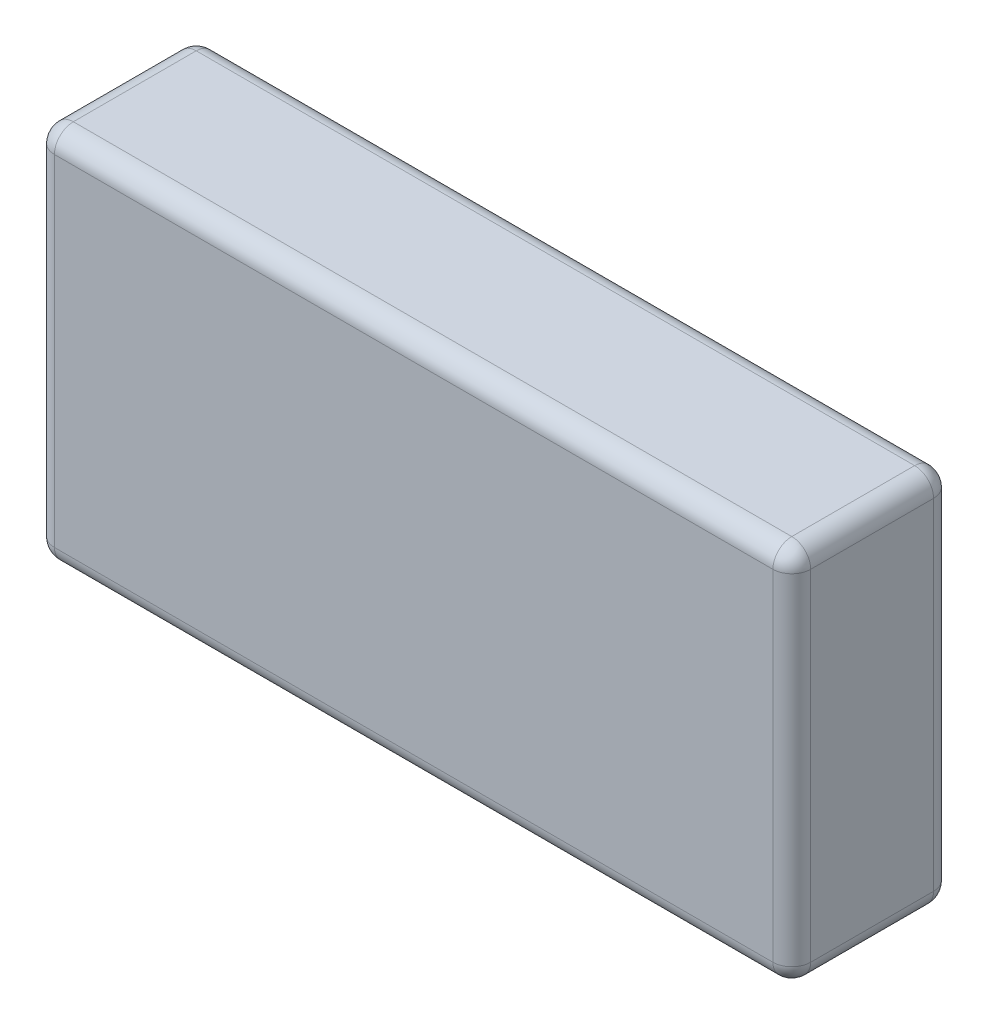
ISO-10303-21;
HEADER;
FILE_DESCRIPTION(('STEP AP214'),'2;1');
FILE_NAME('part.step','',(''),(''),'','','');
FILE_SCHEMA(('AUTOMOTIVE_DESIGN { 1 0 10303 214 1 1 1 1 }'));
ENDSEC;
DATA;
#1=APPLICATION_CONTEXT('core data for automotive mechanical design processes');
#2=APPLICATION_PROTOCOL_DEFINITION('international standard','automotive_design',2000,#1);
#3=PRODUCT_CONTEXT('',#1,'mechanical');
#4=PRODUCT('Part','Part','',(#3));
#5=PRODUCT_RELATED_PRODUCT_CATEGORY('part','',(#4));
#6=PRODUCT_DEFINITION_FORMATION('','',#4);
#7=PRODUCT_DEFINITION_CONTEXT('part definition',#1,'design');
#8=PRODUCT_DEFINITION('design','',#6,#7);
#9=PRODUCT_DEFINITION_SHAPE('','',#8);
#10=(LENGTH_UNIT() NAMED_UNIT(*) SI_UNIT(.MILLI.,.METRE.));
#11=(NAMED_UNIT(*) PLANE_ANGLE_UNIT() SI_UNIT($,.RADIAN.));
#12=(NAMED_UNIT(*) SI_UNIT($,.STERADIAN.) SOLID_ANGLE_UNIT());
#13=UNCERTAINTY_MEASURE_WITH_UNIT(LENGTH_MEASURE(1.E-05),#10,'distance_accuracy_value','');
#14=(GEOMETRIC_REPRESENTATION_CONTEXT(3) GLOBAL_UNCERTAINTY_ASSIGNED_CONTEXT((#13)) GLOBAL_UNIT_ASSIGNED_CONTEXT((#10,
#11,#12)) REPRESENTATION_CONTEXT('',''));
#15=CARTESIAN_POINT('',(0.,0.,0.));
#16=DIRECTION('',(0.,0.,1.));
#17=DIRECTION('',(1.,0.,0.));
#18=AXIS2_PLACEMENT_3D('',#15,#16,#17);
#19=CARTESIAN_POINT('',(0.,0.,17.));
#20=DIRECTION('',(1.,0.,0.));
#21=DIRECTION('',(0.,0.,-1.));
#22=AXIS2_PLACEMENT_3D('',#19,#20,#21);
#23=PLANE('',#22);
#24=DIRECTION('',(0.,0.,-1.));
#25=VECTOR('',#24,1.);
#26=CARTESIAN_POINT('',(0.,38.,17.));
#27=LINE('',#26,#25);
#28=CARTESIAN_POINT('',(0.,38.,15.));
#29=VERTEX_POINT('',#28);
#30=CARTESIAN_POINT('',(0.,38.,2.));
#31=VERTEX_POINT('',#30);
#32=EDGE_CURVE('E259',#29,#31,#27,.T.);
#33=ORIENTED_EDGE('',*,*,#32,.T.);
#34=DIRECTION('',(0.,-1.,0.));
#35=VECTOR('',#34,1.);
#36=CARTESIAN_POINT('',(0.,2.,2.));
#37=LINE('',#36,#35);
#38=CARTESIAN_POINT('',(0.,2.,2.));
#39=VERTEX_POINT('',#38);
#40=EDGE_CURVE('E224',#31,#39,#37,.T.);
#41=ORIENTED_EDGE('',*,*,#40,.T.);
#42=DIRECTION('',(0.,0.,-1.));
#43=VECTOR('',#42,1.);
#44=CARTESIAN_POINT('',(0.,2.,17.));
#45=LINE('',#44,#43);
#46=CARTESIAN_POINT('',(0.,2.,15.));
#47=VERTEX_POINT('',#46);
#48=EDGE_CURVE('E150',#39,#47,#45,.F.);
#49=ORIENTED_EDGE('',*,*,#48,.T.);
#50=DIRECTION('',(0.,-1.,0.));
#51=VECTOR('',#50,1.);
#52=CARTESIAN_POINT('',(0.,0.,15.));
#53=LINE('',#52,#51);
#54=EDGE_CURVE('E137',#47,#29,#53,.F.);
#55=ORIENTED_EDGE('',*,*,#54,.T.);
#56=EDGE_LOOP('',(#33,#41,#49,#55));
#57=FACE_BOUND('',#56,.T.);
#58=ADVANCED_FACE('F37',(#57),#23,.F.);
#59=CARTESIAN_POINT('',(0.,0.,17.));
#60=DIRECTION('',(0.,1.,0.));
#61=DIRECTION('',(0.,0.,1.));
#62=AXIS2_PLACEMENT_3D('',#59,#60,#61);
#63=PLANE('',#62);
#64=DIRECTION('',(0.,0.,-1.));
#65=VECTOR('',#64,1.);
#66=CARTESIAN_POINT('',(2.,0.,17.));
#67=LINE('',#66,#65);
#68=CARTESIAN_POINT('',(2.,0.,15.));
#69=VERTEX_POINT('',#68);
#70=CARTESIAN_POINT('',(2.,0.,2.));
#71=VERTEX_POINT('',#70);
#72=EDGE_CURVE('E262',#69,#71,#67,.T.);
#73=ORIENTED_EDGE('',*,*,#72,.T.);
#74=DIRECTION('',(1.,0.,0.));
#75=VECTOR('',#74,1.);
#76=CARTESIAN_POINT('',(78.,0.,2.));
#77=LINE('',#76,#75);
#78=CARTESIAN_POINT('',(78.,0.,2.));
#79=VERTEX_POINT('',#78);
#80=EDGE_CURVE('E236',#71,#79,#77,.T.);
#81=ORIENTED_EDGE('',*,*,#80,.T.);
#82=DIRECTION('',(0.,0.,-1.));
#83=VECTOR('',#82,1.);
#84=CARTESIAN_POINT('',(78.,0.,17.));
#85=LINE('',#84,#83);
#86=CARTESIAN_POINT('',(78.,0.,15.));
#87=VERTEX_POINT('',#86);
#88=EDGE_CURVE('E187',#79,#87,#85,.F.);
#89=ORIENTED_EDGE('',*,*,#88,.T.);
#90=DIRECTION('',(1.,0.,0.));
#91=VECTOR('',#90,1.);
#92=CARTESIAN_POINT('',(0.,0.,15.));
#93=LINE('',#92,#91);
#94=EDGE_CURVE('E238',#87,#69,#93,.F.);
#95=ORIENTED_EDGE('',*,*,#94,.T.);
#96=EDGE_LOOP('',(#73,#81,#89,#95));
#97=FACE_BOUND('',#96,.T.);
#98=ADVANCED_FACE('F268',(#97),#63,.F.);
#99=CARTESIAN_POINT('',(80.,40.,17.));
#100=DIRECTION('',(-1.,0.,0.));
#101=DIRECTION('',(0.,0.,1.));
#102=AXIS2_PLACEMENT_3D('',#99,#100,#101);
#103=PLANE('',#102);
#104=DIRECTION('',(0.,0.,-1.));
#105=VECTOR('',#104,1.);
#106=CARTESIAN_POINT('',(80.,2.,17.));
#107=LINE('',#106,#105);
#108=CARTESIAN_POINT('',(80.,2.,15.));
#109=VERTEX_POINT('',#108);
#110=CARTESIAN_POINT('',(80.,2.,2.));
#111=VERTEX_POINT('',#110);
#112=EDGE_CURVE('E132',#109,#111,#107,.T.);
#113=ORIENTED_EDGE('',*,*,#112,.T.);
#114=DIRECTION('',(0.,1.,0.));
#115=VECTOR('',#114,1.);
#116=CARTESIAN_POINT('',(80.,38.,2.));
#117=LINE('',#116,#115);
#118=CARTESIAN_POINT('',(80.,38.,2.));
#119=VERTEX_POINT('',#118);
#120=EDGE_CURVE('E127',#111,#119,#117,.T.);
#121=ORIENTED_EDGE('',*,*,#120,.T.);
#122=DIRECTION('',(0.,0.,-1.));
#123=VECTOR('',#122,1.);
#124=CARTESIAN_POINT('',(80.,38.,17.));
#125=LINE('',#124,#123);
#126=CARTESIAN_POINT('',(80.,38.,15.));
#127=VERTEX_POINT('',#126);
#128=EDGE_CURVE('E130',#119,#127,#125,.F.);
#129=ORIENTED_EDGE('',*,*,#128,.T.);
#130=DIRECTION('',(0.,1.,0.));
#131=VECTOR('',#130,1.);
#132=CARTESIAN_POINT('',(80.,40.,15.));
#133=LINE('',#132,#131);
#134=EDGE_CURVE('E138',#127,#109,#133,.F.);
#135=ORIENTED_EDGE('',*,*,#134,.T.);
#136=EDGE_LOOP('',(#113,#121,#129,#135));
#137=FACE_BOUND('',#136,.T.);
#138=ADVANCED_FACE('F129',(#137),#103,.F.);
#139=CARTESIAN_POINT('',(0.,40.,17.));
#140=DIRECTION('',(0.,-1.,0.));
#141=DIRECTION('',(0.,0.,-1.));
#142=AXIS2_PLACEMENT_3D('',#139,#140,#141);
#143=PLANE('',#142);
#144=DIRECTION('',(0.,0.,-1.));
#145=VECTOR('',#144,1.);
#146=CARTESIAN_POINT('',(78.,40.,17.));
#147=LINE('',#146,#145);
#148=CARTESIAN_POINT('',(78.,40.,15.));
#149=VERTEX_POINT('',#148);
#150=CARTESIAN_POINT('',(78.,40.,2.));
#151=VERTEX_POINT('',#150);
#152=EDGE_CURVE('E251',#149,#151,#147,.T.);
#153=ORIENTED_EDGE('',*,*,#152,.T.);
#154=DIRECTION('',(-1.,0.,0.));
#155=VECTOR('',#154,1.);
#156=CARTESIAN_POINT('',(2.,40.,2.));
#157=LINE('',#156,#155);
#158=CARTESIAN_POINT('',(2.,40.,2.));
#159=VERTEX_POINT('',#158);
#160=EDGE_CURVE('E220',#151,#159,#157,.T.);
#161=ORIENTED_EDGE('',*,*,#160,.T.);
#162=DIRECTION('',(0.,0.,-1.));
#163=VECTOR('',#162,1.);
#164=CARTESIAN_POINT('',(2.,40.,17.));
#165=LINE('',#164,#163);
#166=CARTESIAN_POINT('',(2.,40.,15.));
#167=VERTEX_POINT('',#166);
#168=EDGE_CURVE('E253',#159,#167,#165,.F.);
#169=ORIENTED_EDGE('',*,*,#168,.T.);
#170=DIRECTION('',(-1.,0.,0.));
#171=VECTOR('',#170,1.);
#172=CARTESIAN_POINT('',(0.,40.,15.));
#173=LINE('',#172,#171);
#174=EDGE_CURVE('E222',#167,#149,#173,.F.);
#175=ORIENTED_EDGE('',*,*,#174,.T.);
#176=EDGE_LOOP('',(#153,#161,#169,#175));
#177=FACE_BOUND('',#176,.T.);
#178=ADVANCED_FACE('F297',(#177),#143,.F.);
#179=CARTESIAN_POINT('',(0.,0.,17.));
#180=DIRECTION('',(0.,0.,-1.));
#181=DIRECTION('',(-1.,0.,0.));
#182=AXIS2_PLACEMENT_3D('',#179,#180,#181);
#183=PLANE('',#182);
#184=DIRECTION('',(1.,0.,0.));
#185=VECTOR('',#184,1.);
#186=CARTESIAN_POINT('',(0.,2.,17.));
#187=LINE('',#186,#185);
#188=CARTESIAN_POINT('',(2.,2.,17.));
#189=VERTEX_POINT('',#188);
#190=CARTESIAN_POINT('',(78.,2.,17.));
#191=VERTEX_POINT('',#190);
#192=EDGE_CURVE('E46',#189,#191,#187,.T.);
#193=ORIENTED_EDGE('',*,*,#192,.T.);
#194=DIRECTION('',(0.,1.,0.));
#195=VECTOR('',#194,1.);
#196=CARTESIAN_POINT('',(78.,0.,17.));
#197=LINE('',#196,#195);
#198=CARTESIAN_POINT('',(78.,38.,17.));
#199=VERTEX_POINT('',#198);
#200=EDGE_CURVE('E11',#191,#199,#197,.T.);
#201=ORIENTED_EDGE('',*,*,#200,.T.);
#202=DIRECTION('',(-1.,0.,0.));
#203=VECTOR('',#202,1.);
#204=CARTESIAN_POINT('',(0.,38.,17.));
#205=LINE('',#204,#203);
#206=CARTESIAN_POINT('',(2.,38.,17.));
#207=VERTEX_POINT('',#206);
#208=EDGE_CURVE('E216',#199,#207,#205,.T.);
#209=ORIENTED_EDGE('',*,*,#208,.T.);
#210=DIRECTION('',(0.,-1.,0.));
#211=VECTOR('',#210,1.);
#212=CARTESIAN_POINT('',(2.,0.,17.));
#213=LINE('',#212,#211);
#214=EDGE_CURVE('E57',#207,#189,#213,.T.);
#215=ORIENTED_EDGE('',*,*,#214,.T.);
#216=EDGE_LOOP('',(#193,#201,#209,#215));
#217=FACE_BOUND('',#216,.T.);
#218=ADVANCED_FACE('F282',(#217),#183,.F.);
#219=CARTESIAN_POINT('',(0.,0.,0.));
#220=DIRECTION('',(0.,0.,-1.));
#221=DIRECTION('',(-1.,0.,0.));
#222=AXIS2_PLACEMENT_3D('',#219,#220,#221);
#223=PLANE('',#222);
#224=DIRECTION('',(0.,1.,0.));
#225=VECTOR('',#224,1.);
#226=CARTESIAN_POINT('',(78.,2.,0.));
#227=LINE('',#226,#225);
#228=CARTESIAN_POINT('',(78.,38.,0.));
#229=VERTEX_POINT('',#228);
#230=CARTESIAN_POINT('',(78.,2.,0.));
#231=VERTEX_POINT('',#230);
#232=EDGE_CURVE('E163',#229,#231,#227,.F.);
#233=ORIENTED_EDGE('',*,*,#232,.T.);
#234=DIRECTION('',(1.,0.,0.));
#235=VECTOR('',#234,1.);
#236=CARTESIAN_POINT('',(2.,2.,0.));
#237=LINE('',#236,#235);
#238=CARTESIAN_POINT('',(2.,2.,0.));
#239=VERTEX_POINT('',#238);
#240=EDGE_CURVE('E228',#231,#239,#237,.F.);
#241=ORIENTED_EDGE('',*,*,#240,.T.);
#242=DIRECTION('',(0.,-1.,0.));
#243=VECTOR('',#242,1.);
#244=CARTESIAN_POINT('',(2.,38.,0.));
#245=LINE('',#244,#243);
#246=CARTESIAN_POINT('',(2.,38.,0.));
#247=VERTEX_POINT('',#246);
#248=EDGE_CURVE('E232',#239,#247,#245,.F.);
#249=ORIENTED_EDGE('',*,*,#248,.T.);
#250=DIRECTION('',(-1.,0.,0.));
#251=VECTOR('',#250,1.);
#252=CARTESIAN_POINT('',(78.,38.,0.));
#253=LINE('',#252,#251);
#254=EDGE_CURVE('E234',#247,#229,#253,.F.);
#255=ORIENTED_EDGE('',*,*,#254,.T.);
#256=EDGE_LOOP('',(#233,#241,#249,#255));
#257=FACE_BOUND('',#256,.T.);
#258=ADVANCED_FACE('F319',(#257),#223,.T.);
#259=CARTESIAN_POINT('',(2.,2.,17.));
#260=DIRECTION('',(0.,0.,-1.));
#261=DIRECTION('',(-1.,0.,0.));
#262=AXIS2_PLACEMENT_3D('',#259,#260,#261);
#263=CYLINDRICAL_SURFACE('',#262,2.);
#264=ORIENTED_EDGE('',*,*,#48,.F.);
#265=CARTESIAN_POINT('',(2.,2.,2.));
#266=DIRECTION('',(0.,0.,-1.));
#267=DIRECTION('',(-1.,0.,0.));
#268=AXIS2_PLACEMENT_3D('',#265,#266,#267);
#269=CIRCLE('',#268,2.);
#270=EDGE_CURVE('E244',#39,#71,#269,.F.);
#271=ORIENTED_EDGE('',*,*,#270,.T.);
#272=ORIENTED_EDGE('',*,*,#72,.F.);
#273=CARTESIAN_POINT('',(2.,2.,15.));
#274=DIRECTION('',(0.,0.,-1.));
#275=DIRECTION('',(-1.,0.,0.));
#276=AXIS2_PLACEMENT_3D('',#273,#274,#275);
#277=CIRCLE('',#276,2.);
#278=EDGE_CURVE('E211',#69,#47,#277,.T.);
#279=ORIENTED_EDGE('',*,*,#278,.T.);
#280=EDGE_LOOP('',(#264,#271,#272,#279));
#281=FACE_BOUND('',#280,.T.);
#282=ADVANCED_FACE('F321',(#281),#263,.T.);
#283=CARTESIAN_POINT('',(78.,2.,17.));
#284=DIRECTION('',(0.,0.,-1.));
#285=DIRECTION('',(-1.,0.,0.));
#286=AXIS2_PLACEMENT_3D('',#283,#284,#285);
#287=CYLINDRICAL_SURFACE('',#286,2.);
#288=ORIENTED_EDGE('',*,*,#88,.F.);
#289=CARTESIAN_POINT('',(78.,2.,2.));
#290=DIRECTION('',(0.,0.,-1.));
#291=DIRECTION('',(-1.,0.,0.));
#292=AXIS2_PLACEMENT_3D('',#289,#290,#291);
#293=CIRCLE('',#292,2.);
#294=EDGE_CURVE('E247',#79,#111,#293,.F.);
#295=ORIENTED_EDGE('',*,*,#294,.T.);
#296=ORIENTED_EDGE('',*,*,#112,.F.);
#297=CARTESIAN_POINT('',(78.,2.,15.));
#298=DIRECTION('',(0.,0.,-1.));
#299=DIRECTION('',(-1.,0.,0.));
#300=AXIS2_PLACEMENT_3D('',#297,#298,#299);
#301=CIRCLE('',#300,2.);
#302=EDGE_CURVE('E159',#109,#87,#301,.T.);
#303=ORIENTED_EDGE('',*,*,#302,.T.);
#304=EDGE_LOOP('',(#288,#295,#296,#303));
#305=FACE_BOUND('',#304,.T.);
#306=ADVANCED_FACE('F327',(#305),#287,.T.);
#307=CARTESIAN_POINT('',(78.,38.,17.));
#308=DIRECTION('',(0.,0.,-1.));
#309=DIRECTION('',(-1.,0.,0.));
#310=AXIS2_PLACEMENT_3D('',#307,#308,#309);
#311=CYLINDRICAL_SURFACE('',#310,2.);
#312=ORIENTED_EDGE('',*,*,#128,.F.);
#313=CARTESIAN_POINT('',(78.,38.,2.));
#314=DIRECTION('',(0.,0.,-1.));
#315=DIRECTION('',(-1.,0.,0.));
#316=AXIS2_PLACEMENT_3D('',#313,#314,#315);
#317=CIRCLE('',#316,2.);
#318=EDGE_CURVE('E146',#119,#151,#317,.F.);
#319=ORIENTED_EDGE('',*,*,#318,.T.);
#320=ORIENTED_EDGE('',*,*,#152,.F.);
#321=CARTESIAN_POINT('',(78.,38.,15.));
#322=DIRECTION('',(0.,0.,-1.));
#323=DIRECTION('',(-1.,0.,0.));
#324=AXIS2_PLACEMENT_3D('',#321,#322,#323);
#325=CIRCLE('',#324,2.);
#326=EDGE_CURVE('E149',#149,#127,#325,.T.);
#327=ORIENTED_EDGE('',*,*,#326,.T.);
#328=EDGE_LOOP('',(#312,#319,#320,#327));
#329=FACE_BOUND('',#328,.T.);
#330=ADVANCED_FACE('F144',(#329),#311,.T.);
#331=CARTESIAN_POINT('',(2.,38.,17.));
#332=DIRECTION('',(0.,0.,-1.));
#333=DIRECTION('',(-1.,0.,0.));
#334=AXIS2_PLACEMENT_3D('',#331,#332,#333);
#335=CYLINDRICAL_SURFACE('',#334,2.);
#336=ORIENTED_EDGE('',*,*,#168,.F.);
#337=CARTESIAN_POINT('',(2.,38.,2.));
#338=DIRECTION('',(0.,0.,-1.));
#339=DIRECTION('',(-1.,0.,0.));
#340=AXIS2_PLACEMENT_3D('',#337,#338,#339);
#341=CIRCLE('',#340,2.);
#342=EDGE_CURVE('E240',#159,#31,#341,.F.);
#343=ORIENTED_EDGE('',*,*,#342,.T.);
#344=ORIENTED_EDGE('',*,*,#32,.F.);
#345=CARTESIAN_POINT('',(2.,38.,15.));
#346=DIRECTION('',(0.,0.,-1.));
#347=DIRECTION('',(-1.,0.,0.));
#348=AXIS2_PLACEMENT_3D('',#345,#346,#347);
#349=CIRCLE('',#348,2.);
#350=EDGE_CURVE('E242',#29,#167,#349,.T.);
#351=ORIENTED_EDGE('',*,*,#350,.T.);
#352=EDGE_LOOP('',(#336,#343,#344,#351));
#353=FACE_BOUND('',#352,.T.);
#354=ADVANCED_FACE('F294',(#353),#335,.T.);
#355=CARTESIAN_POINT('',(2.,2.,2.));
#356=DIRECTION('',(0.,0.,-1.));
#357=DIRECTION('',(-1.,0.,0.));
#358=AXIS2_PLACEMENT_3D('',#355,#356,#357);
#359=SPHERICAL_SURFACE('',#358,2.);
#360=CARTESIAN_POINT('',(2.,2.,2.));
#361=DIRECTION('',(1.,0.,0.));
#362=DIRECTION('',(0.,0.,-1.));
#363=AXIS2_PLACEMENT_3D('',#360,#361,#362);
#364=CIRCLE('',#363,2.);
#365=EDGE_CURVE('E181',#71,#239,#364,.T.);
#366=ORIENTED_EDGE('',*,*,#365,.F.);
#367=ORIENTED_EDGE('',*,*,#270,.F.);
#368=CARTESIAN_POINT('',(2.,2.,2.));
#369=DIRECTION('',(0.,1.,0.));
#370=DIRECTION('',(0.,0.,1.));
#371=AXIS2_PLACEMENT_3D('',#368,#369,#370);
#372=CIRCLE('',#371,2.);
#373=EDGE_CURVE('E184',#239,#39,#372,.T.);
#374=ORIENTED_EDGE('',*,*,#373,.F.);
#375=EDGE_LOOP('',(#366,#367,#374));
#376=FACE_BOUND('',#375,.T.);
#377=ADVANCED_FACE('F314',(#376),#359,.T.);
#378=CARTESIAN_POINT('',(2.,0.,2.));
#379=DIRECTION('',(0.,1.,0.));
#380=DIRECTION('',(0.,0.,1.));
#381=AXIS2_PLACEMENT_3D('',#378,#379,#380);
#382=CYLINDRICAL_SURFACE('',#381,2.);
#383=ORIENTED_EDGE('',*,*,#373,.T.);
#384=ORIENTED_EDGE('',*,*,#40,.F.);
#385=CARTESIAN_POINT('',(2.,38.,2.));
#386=DIRECTION('',(0.,1.,0.));
#387=DIRECTION('',(0.,0.,1.));
#388=AXIS2_PLACEMENT_3D('',#385,#386,#387);
#389=CIRCLE('',#388,2.);
#390=EDGE_CURVE('E178',#247,#31,#389,.T.);
#391=ORIENTED_EDGE('',*,*,#390,.F.);
#392=ORIENTED_EDGE('',*,*,#248,.F.);
#393=EDGE_LOOP('',(#383,#384,#391,#392));
#394=FACE_BOUND('',#393,.T.);
#395=ADVANCED_FACE('F309',(#394),#382,.T.);
#396=CARTESIAN_POINT('',(0.,2.,2.));
#397=DIRECTION('',(-1.,0.,0.));
#398=DIRECTION('',(0.,0.,1.));
#399=AXIS2_PLACEMENT_3D('',#396,#397,#398);
#400=CYLINDRICAL_SURFACE('',#399,2.);
#401=ORIENTED_EDGE('',*,*,#365,.T.);
#402=ORIENTED_EDGE('',*,*,#240,.F.);
#403=CARTESIAN_POINT('',(78.,2.,2.));
#404=DIRECTION('',(1.,0.,0.));
#405=DIRECTION('',(0.,0.,-1.));
#406=AXIS2_PLACEMENT_3D('',#403,#404,#405);
#407=CIRCLE('',#406,2.);
#408=EDGE_CURVE('E175',#79,#231,#407,.T.);
#409=ORIENTED_EDGE('',*,*,#408,.F.);
#410=ORIENTED_EDGE('',*,*,#80,.F.);
#411=EDGE_LOOP('',(#401,#402,#409,#410));
#412=FACE_BOUND('',#411,.T.);
#413=ADVANCED_FACE('F317',(#412),#400,.T.);
#414=CARTESIAN_POINT('',(2.,38.,2.));
#415=DIRECTION('',(0.,0.,-1.));
#416=DIRECTION('',(-1.,0.,0.));
#417=AXIS2_PLACEMENT_3D('',#414,#415,#416);
#418=SPHERICAL_SURFACE('',#417,2.);
#419=ORIENTED_EDGE('',*,*,#390,.T.);
#420=ORIENTED_EDGE('',*,*,#342,.F.);
#421=CARTESIAN_POINT('',(2.,38.,2.));
#422=DIRECTION('',(1.,0.,0.));
#423=DIRECTION('',(0.,0.,-1.));
#424=AXIS2_PLACEMENT_3D('',#421,#422,#423);
#425=CIRCLE('',#424,2.);
#426=EDGE_CURVE('E172',#247,#159,#425,.T.);
#427=ORIENTED_EDGE('',*,*,#426,.F.);
#428=EDGE_LOOP('',(#419,#420,#427));
#429=FACE_BOUND('',#428,.T.);
#430=ADVANCED_FACE('F303',(#429),#418,.T.);
#431=CARTESIAN_POINT('',(78.,2.,2.));
#432=DIRECTION('',(0.,0.,-1.));
#433=DIRECTION('',(-1.,0.,0.));
#434=AXIS2_PLACEMENT_3D('',#431,#432,#433);
#435=SPHERICAL_SURFACE('',#434,2.);
#436=ORIENTED_EDGE('',*,*,#294,.F.);
#437=ORIENTED_EDGE('',*,*,#408,.T.);
#438=CARTESIAN_POINT('',(78.,2.,2.));
#439=DIRECTION('',(0.,1.,0.));
#440=DIRECTION('',(0.,0.,1.));
#441=AXIS2_PLACEMENT_3D('',#438,#439,#440);
#442=CIRCLE('',#441,2.);
#443=EDGE_CURVE('E165',#111,#231,#442,.T.);
#444=ORIENTED_EDGE('',*,*,#443,.F.);
#445=EDGE_LOOP('',(#436,#437,#444));
#446=FACE_BOUND('',#445,.T.);
#447=ADVANCED_FACE('F352',(#446),#435,.T.);
#448=CARTESIAN_POINT('',(0.,38.,2.));
#449=DIRECTION('',(1.,0.,0.));
#450=DIRECTION('',(0.,0.,-1.));
#451=AXIS2_PLACEMENT_3D('',#448,#449,#450);
#452=CYLINDRICAL_SURFACE('',#451,2.);
#453=ORIENTED_EDGE('',*,*,#426,.T.);
#454=ORIENTED_EDGE('',*,*,#160,.F.);
#455=CARTESIAN_POINT('',(78.,38.,2.));
#456=DIRECTION('',(1.,0.,0.));
#457=DIRECTION('',(0.,0.,-1.));
#458=AXIS2_PLACEMENT_3D('',#455,#456,#457);
#459=CIRCLE('',#458,2.);
#460=EDGE_CURVE('E157',#229,#151,#459,.T.);
#461=ORIENTED_EDGE('',*,*,#460,.F.);
#462=ORIENTED_EDGE('',*,*,#254,.F.);
#463=EDGE_LOOP('',(#453,#454,#461,#462));
#464=FACE_BOUND('',#463,.T.);
#465=ADVANCED_FACE('F299',(#464),#452,.T.);
#466=CARTESIAN_POINT('',(78.,40.,2.));
#467=DIRECTION('',(0.,-1.,0.));
#468=DIRECTION('',(0.,0.,-1.));
#469=AXIS2_PLACEMENT_3D('',#466,#467,#468);
#470=CYLINDRICAL_SURFACE('',#469,2.);
#471=ORIENTED_EDGE('',*,*,#443,.T.);
#472=ORIENTED_EDGE('',*,*,#232,.F.);
#473=CARTESIAN_POINT('',(78.,38.,2.));
#474=DIRECTION('',(0.,1.,0.));
#475=DIRECTION('',(0.,0.,1.));
#476=AXIS2_PLACEMENT_3D('',#473,#474,#475);
#477=CIRCLE('',#476,2.);
#478=EDGE_CURVE('E155',#119,#229,#477,.T.);
#479=ORIENTED_EDGE('',*,*,#478,.F.);
#480=ORIENTED_EDGE('',*,*,#120,.F.);
#481=EDGE_LOOP('',(#471,#472,#479,#480));
#482=FACE_BOUND('',#481,.T.);
#483=ADVANCED_FACE('F162',(#482),#470,.T.);
#484=CARTESIAN_POINT('',(78.,38.,2.));
#485=DIRECTION('',(0.,0.,-1.));
#486=DIRECTION('',(-1.,0.,0.));
#487=AXIS2_PLACEMENT_3D('',#484,#485,#486);
#488=SPHERICAL_SURFACE('',#487,2.);
#489=ORIENTED_EDGE('',*,*,#460,.T.);
#490=ORIENTED_EDGE('',*,*,#318,.F.);
#491=ORIENTED_EDGE('',*,*,#478,.T.);
#492=EDGE_LOOP('',(#489,#490,#491));
#493=FACE_BOUND('',#492,.T.);
#494=ADVANCED_FACE('F154',(#493),#488,.T.);
#495=CARTESIAN_POINT('',(2.,2.,15.));
#496=DIRECTION('',(0.,0.,-1.));
#497=DIRECTION('',(-1.,0.,0.));
#498=AXIS2_PLACEMENT_3D('',#495,#496,#497);
#499=SPHERICAL_SURFACE('',#498,2.);
#500=CARTESIAN_POINT('',(2.,2.,15.));
#501=DIRECTION('',(0.,1.,0.));
#502=DIRECTION('',(0.,0.,1.));
#503=AXIS2_PLACEMENT_3D('',#500,#501,#502);
#504=CIRCLE('',#503,2.);
#505=EDGE_CURVE('E168',#47,#189,#504,.T.);
#506=ORIENTED_EDGE('',*,*,#505,.F.);
#507=ORIENTED_EDGE('',*,*,#278,.F.);
#508=CARTESIAN_POINT('',(2.,2.,15.));
#509=DIRECTION('',(1.,0.,0.));
#510=DIRECTION('',(0.,0.,-1.));
#511=AXIS2_PLACEMENT_3D('',#508,#509,#510);
#512=CIRCLE('',#511,2.);
#513=EDGE_CURVE('E41',#189,#69,#512,.T.);
#514=ORIENTED_EDGE('',*,*,#513,.F.);
#515=EDGE_LOOP('',(#506,#507,#514));
#516=FACE_BOUND('',#515,.T.);
#517=ADVANCED_FACE('F39',(#516),#499,.T.);
#518=CARTESIAN_POINT('',(0.,2.,15.));
#519=DIRECTION('',(1.,0.,0.));
#520=DIRECTION('',(0.,0.,-1.));
#521=AXIS2_PLACEMENT_3D('',#518,#519,#520);
#522=CYLINDRICAL_SURFACE('',#521,2.);
#523=ORIENTED_EDGE('',*,*,#513,.T.);
#524=ORIENTED_EDGE('',*,*,#94,.F.);
#525=CARTESIAN_POINT('',(78.,2.,15.));
#526=DIRECTION('',(1.,0.,0.));
#527=DIRECTION('',(0.,0.,-1.));
#528=AXIS2_PLACEMENT_3D('',#525,#526,#527);
#529=CIRCLE('',#528,2.);
#530=EDGE_CURVE('E201',#191,#87,#529,.T.);
#531=ORIENTED_EDGE('',*,*,#530,.F.);
#532=ORIENTED_EDGE('',*,*,#192,.F.);
#533=EDGE_LOOP('',(#523,#524,#531,#532));
#534=FACE_BOUND('',#533,.T.);
#535=ADVANCED_FACE('F214',(#534),#522,.T.);
#536=CARTESIAN_POINT('',(2.,0.,15.));
#537=DIRECTION('',(0.,-1.,0.));
#538=DIRECTION('',(0.,0.,-1.));
#539=AXIS2_PLACEMENT_3D('',#536,#537,#538);
#540=CYLINDRICAL_SURFACE('',#539,2.);
#541=ORIENTED_EDGE('',*,*,#505,.T.);
#542=ORIENTED_EDGE('',*,*,#214,.F.);
#543=CARTESIAN_POINT('',(2.,38.,15.));
#544=DIRECTION('',(0.,1.,0.));
#545=DIRECTION('',(0.,0.,1.));
#546=AXIS2_PLACEMENT_3D('',#543,#544,#545);
#547=CIRCLE('',#546,2.);
#548=EDGE_CURVE('E198',#29,#207,#547,.T.);
#549=ORIENTED_EDGE('',*,*,#548,.F.);
#550=ORIENTED_EDGE('',*,*,#54,.F.);
#551=EDGE_LOOP('',(#541,#542,#549,#550));
#552=FACE_BOUND('',#551,.T.);
#553=ADVANCED_FACE('F207',(#552),#540,.T.);
#554=CARTESIAN_POINT('',(78.,2.,15.));
#555=DIRECTION('',(0.,0.,-1.));
#556=DIRECTION('',(-1.,0.,0.));
#557=AXIS2_PLACEMENT_3D('',#554,#555,#556);
#558=SPHERICAL_SURFACE('',#557,2.);
#559=ORIENTED_EDGE('',*,*,#530,.T.);
#560=ORIENTED_EDGE('',*,*,#302,.F.);
#561=CARTESIAN_POINT('',(78.,2.,15.));
#562=DIRECTION('',(0.,1.,0.));
#563=DIRECTION('',(0.,0.,1.));
#564=AXIS2_PLACEMENT_3D('',#561,#562,#563);
#565=CIRCLE('',#564,2.);
#566=EDGE_CURVE('E195',#191,#109,#565,.T.);
#567=ORIENTED_EDGE('',*,*,#566,.F.);
#568=EDGE_LOOP('',(#559,#560,#567));
#569=FACE_BOUND('',#568,.T.);
#570=ADVANCED_FACE('F275',(#569),#558,.T.);
#571=CARTESIAN_POINT('',(2.,38.,15.));
#572=DIRECTION('',(0.,0.,-1.));
#573=DIRECTION('',(-1.,0.,0.));
#574=AXIS2_PLACEMENT_3D('',#571,#572,#573);
#575=SPHERICAL_SURFACE('',#574,2.);
#576=ORIENTED_EDGE('',*,*,#350,.F.);
#577=ORIENTED_EDGE('',*,*,#548,.T.);
#578=CARTESIAN_POINT('',(2.,38.,15.));
#579=DIRECTION('',(1.,0.,0.));
#580=DIRECTION('',(0.,0.,-1.));
#581=AXIS2_PLACEMENT_3D('',#578,#579,#580);
#582=CIRCLE('',#581,2.);
#583=EDGE_CURVE('E192',#167,#207,#582,.T.);
#584=ORIENTED_EDGE('',*,*,#583,.F.);
#585=EDGE_LOOP('',(#576,#577,#584));
#586=FACE_BOUND('',#585,.T.);
#587=ADVANCED_FACE('F290',(#586),#575,.T.);
#588=CARTESIAN_POINT('',(78.,0.,15.));
#589=DIRECTION('',(0.,1.,0.));
#590=DIRECTION('',(0.,0.,1.));
#591=AXIS2_PLACEMENT_3D('',#588,#589,#590);
#592=CYLINDRICAL_SURFACE('',#591,2.);
#593=ORIENTED_EDGE('',*,*,#566,.T.);
#594=ORIENTED_EDGE('',*,*,#134,.F.);
#595=CARTESIAN_POINT('',(78.,38.,15.));
#596=DIRECTION('',(0.,1.,0.));
#597=DIRECTION('',(0.,0.,1.));
#598=AXIS2_PLACEMENT_3D('',#595,#596,#597);
#599=CIRCLE('',#598,2.);
#600=EDGE_CURVE('E190',#199,#127,#599,.T.);
#601=ORIENTED_EDGE('',*,*,#600,.F.);
#602=ORIENTED_EDGE('',*,*,#200,.F.);
#603=EDGE_LOOP('',(#593,#594,#601,#602));
#604=FACE_BOUND('',#603,.T.);
#605=ADVANCED_FACE('F280',(#604),#592,.T.);
#606=CARTESIAN_POINT('',(0.,38.,15.));
#607=DIRECTION('',(-1.,0.,0.));
#608=DIRECTION('',(0.,0.,1.));
#609=AXIS2_PLACEMENT_3D('',#606,#607,#608);
#610=CYLINDRICAL_SURFACE('',#609,2.);
#611=ORIENTED_EDGE('',*,*,#583,.T.);
#612=ORIENTED_EDGE('',*,*,#208,.F.);
#613=CARTESIAN_POINT('',(78.,38.,15.));
#614=DIRECTION('',(1.,0.,0.));
#615=DIRECTION('',(0.,0.,-1.));
#616=AXIS2_PLACEMENT_3D('',#613,#614,#615);
#617=CIRCLE('',#616,2.);
#618=EDGE_CURVE('E188',#149,#199,#617,.T.);
#619=ORIENTED_EDGE('',*,*,#618,.F.);
#620=ORIENTED_EDGE('',*,*,#174,.F.);
#621=EDGE_LOOP('',(#611,#612,#619,#620));
#622=FACE_BOUND('',#621,.T.);
#623=ADVANCED_FACE('F285',(#622),#610,.T.);
#624=CARTESIAN_POINT('',(78.,38.,15.));
#625=DIRECTION('',(0.,0.,-1.));
#626=DIRECTION('',(-1.,0.,0.));
#627=AXIS2_PLACEMENT_3D('',#624,#625,#626);
#628=SPHERICAL_SURFACE('',#627,2.);
#629=ORIENTED_EDGE('',*,*,#600,.T.);
#630=ORIENTED_EDGE('',*,*,#326,.F.);
#631=ORIENTED_EDGE('',*,*,#618,.T.);
#632=EDGE_LOOP('',(#629,#630,#631));
#633=FACE_BOUND('',#632,.T.);
#634=ADVANCED_FACE('F364',(#633),#628,.T.);
#635=CLOSED_SHELL('',(#58,#98,#138,#178,#218,#258,#282,#306,#330,#354,#377,#395,#413,#430,#447,
#465,#483,#494,#517,#535,#553,#570,#587,#605,#623,#634));
#636=MANIFOLD_SOLID_BREP('B2',#635);
#637=ADVANCED_BREP_SHAPE_REPRESENTATION('',(#18,#636),#14);
#638=SHAPE_DEFINITION_REPRESENTATION(#9,#637);
ENDSEC;
END-ISO-10303-21;
